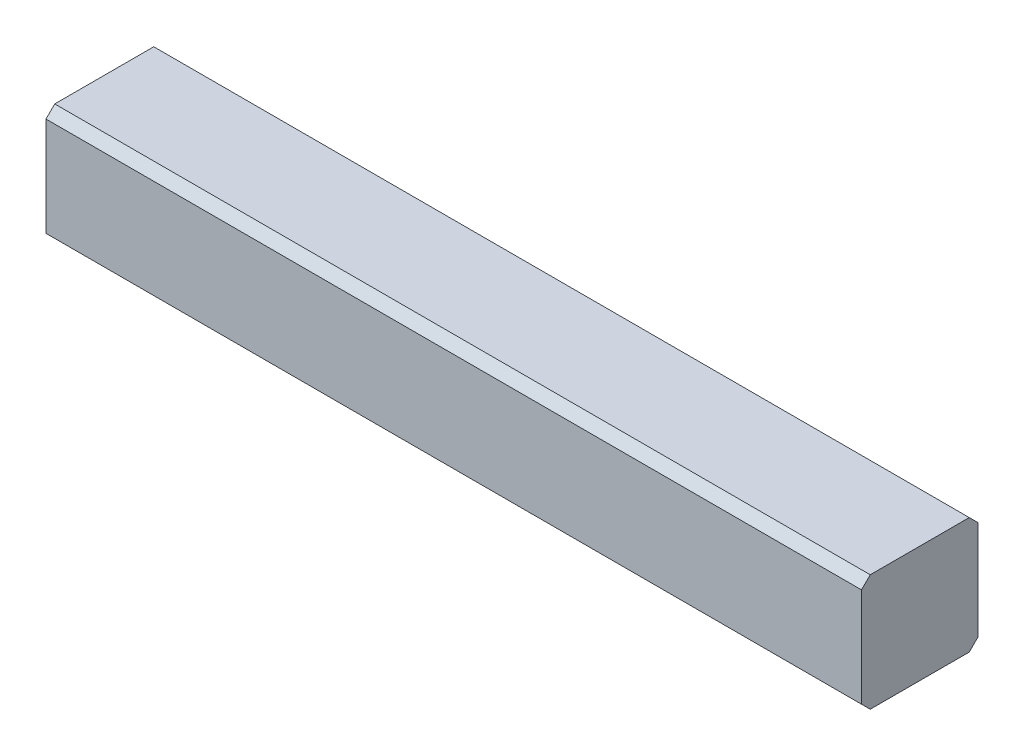
ISO-10303-21;
HEADER;
FILE_DESCRIPTION(('STEP AP214'),'2;1');
FILE_NAME('part.step','',(''),(''),'','','');
FILE_SCHEMA(('AUTOMOTIVE_DESIGN { 1 0 10303 214 1 1 1 1 }'));
ENDSEC;
DATA;
#1=APPLICATION_CONTEXT('core data for automotive mechanical design processes');
#2=APPLICATION_PROTOCOL_DEFINITION('international standard','automotive_design',2000,#1);
#3=PRODUCT_CONTEXT('',#1,'mechanical');
#4=PRODUCT('Part','Part','',(#3));
#5=PRODUCT_RELATED_PRODUCT_CATEGORY('part','',(#4));
#6=PRODUCT_DEFINITION_FORMATION('','',#4);
#7=PRODUCT_DEFINITION_CONTEXT('part definition',#1,'design');
#8=PRODUCT_DEFINITION('design','',#6,#7);
#9=PRODUCT_DEFINITION_SHAPE('','',#8);
#10=(LENGTH_UNIT() NAMED_UNIT(*) SI_UNIT(.MILLI.,.METRE.));
#11=(NAMED_UNIT(*) PLANE_ANGLE_UNIT() SI_UNIT($,.RADIAN.));
#12=(NAMED_UNIT(*) SI_UNIT($,.STERADIAN.) SOLID_ANGLE_UNIT());
#13=UNCERTAINTY_MEASURE_WITH_UNIT(LENGTH_MEASURE(1.E-05),#10,'distance_accuracy_value','');
#14=(GEOMETRIC_REPRESENTATION_CONTEXT(3) GLOBAL_UNCERTAINTY_ASSIGNED_CONTEXT((#13)) GLOBAL_UNIT_ASSIGNED_CONTEXT((#10,
#11,#12)) REPRESENTATION_CONTEXT('',''));
#15=CARTESIAN_POINT('',(0.,0.,0.));
#16=DIRECTION('',(0.,0.,1.));
#17=DIRECTION('',(1.,0.,0.));
#18=AXIS2_PLACEMENT_3D('',#15,#16,#17);
#19=CARTESIAN_POINT('',(14.,0.849999999999962,1.00000000000001));
#20=DIRECTION('',(0.,0.,-1.));
#21=DIRECTION('',(0.,1.,0.));
#22=AXIS2_PLACEMENT_3D('',#19,#20,#21);
#23=PLANE('',#22);
#24=DIRECTION('',(0.,-1.,0.));
#25=VECTOR('',#24,1.);
#26=CARTESIAN_POINT('',(0.,0.849999999999948,0.99999999999998));
#27=LINE('',#26,#25);
#28=CARTESIAN_POINT('',(0.,0.849999999999948,0.99999999999998));
#29=VERTEX_POINT('',#28);
#30=CARTESIAN_POINT('',(0.,-0.850000000000045,0.99999999999998));
#31=VERTEX_POINT('',#30);
#32=EDGE_CURVE('E128',#29,#31,#27,.T.);
#33=ORIENTED_EDGE('',*,*,#32,.T.);
#34=DIRECTION('',(-0.999999999999998,0.,0.));
#35=VECTOR('',#34,1.);
#36=CARTESIAN_POINT('',(14.,-0.850000000000017,0.99999999999998));
#37=LINE('',#36,#35);
#38=CARTESIAN_POINT('',(14.,-0.850000000000017,0.99999999999998));
#39=VERTEX_POINT('',#38);
#40=EDGE_CURVE('E11',#39,#31,#37,.T.);
#41=ORIENTED_EDGE('',*,*,#40,.F.);
#42=DIRECTION('',(0.,-1.,0.));
#43=VECTOR('',#42,1.);
#44=CARTESIAN_POINT('',(14.,0.849999999999962,1.00000000000001));
#45=LINE('',#44,#43);
#46=CARTESIAN_POINT('',(14.,0.849999999999962,1.00000000000001));
#47=VERTEX_POINT('',#46);
#48=EDGE_CURVE('E142',#47,#39,#45,.T.);
#49=ORIENTED_EDGE('',*,*,#48,.F.);
#50=DIRECTION('',(-0.999999999999998,0.,0.));
#51=VECTOR('',#50,1.);
#52=CARTESIAN_POINT('',(14.,0.849999999999962,1.00000000000001));
#53=LINE('',#52,#51);
#54=EDGE_CURVE('E124',#47,#29,#53,.T.);
#55=ORIENTED_EDGE('',*,*,#54,.T.);
#56=EDGE_LOOP('',(#33,#41,#49,#55));
#57=FACE_BOUND('',#56,.T.);
#58=ADVANCED_FACE('F32',(#57),#23,.F.);
#59=CARTESIAN_POINT('',(14.,-0.850000000000017,0.99999999999998));
#60=DIRECTION('',(0.,0.70710678118655,-0.707106781186548));
#61=DIRECTION('',(0.,0.707106781186549,0.707106781186549));
#62=AXIS2_PLACEMENT_3D('',#59,#60,#61);
#63=PLANE('',#62);
#64=DIRECTION('',(0.,-0.707106781186549,-0.707106781186549));
#65=VECTOR('',#64,1.);
#66=CARTESIAN_POINT('',(0.,-0.850000000000045,0.99999999999998));
#67=LINE('',#66,#65);
#68=CARTESIAN_POINT('',(0.,-1.00000000000006,0.849999999999997));
#69=VERTEX_POINT('',#68);
#70=EDGE_CURVE('E131',#31,#69,#67,.T.);
#71=ORIENTED_EDGE('',*,*,#70,.T.);
#72=DIRECTION('',(-0.999999999999998,0.,0.));
#73=VECTOR('',#72,1.);
#74=CARTESIAN_POINT('',(14.,-1.00000000000006,0.849999999999997));
#75=LINE('',#74,#73);
#76=CARTESIAN_POINT('',(14.,-1.00000000000006,0.849999999999997));
#77=VERTEX_POINT('',#76);
#78=EDGE_CURVE('E40',#77,#69,#75,.T.);
#79=ORIENTED_EDGE('',*,*,#78,.F.);
#80=DIRECTION('',(0.,-0.707106781186549,-0.707106781186549));
#81=VECTOR('',#80,1.);
#82=CARTESIAN_POINT('',(14.,-0.850000000000017,0.99999999999998));
#83=LINE('',#82,#81);
#84=EDGE_CURVE('E91',#39,#77,#83,.T.);
#85=ORIENTED_EDGE('',*,*,#84,.F.);
#86=ORIENTED_EDGE('',*,*,#40,.T.);
#87=EDGE_LOOP('',(#71,#79,#85,#86));
#88=FACE_BOUND('',#87,.T.);
#89=ADVANCED_FACE('F177',(#88),#63,.F.);
#90=CARTESIAN_POINT('',(14.,-1.00000000000006,0.849999999999997));
#91=DIRECTION('',(0.,1.,0.));
#92=DIRECTION('',(0.,0.,1.));
#93=AXIS2_PLACEMENT_3D('',#90,#91,#92);
#94=PLANE('',#93);
#95=DIRECTION('',(0.,0.,-1.));
#96=VECTOR('',#95,1.);
#97=CARTESIAN_POINT('',(0.,-1.00000000000006,0.849999999999997));
#98=LINE('',#97,#96);
#99=CARTESIAN_POINT('',(0.,-1.00000000000001,-0.850000000000004));
#100=VERTEX_POINT('',#99);
#101=EDGE_CURVE('E133',#69,#100,#98,.T.);
#102=ORIENTED_EDGE('',*,*,#101,.T.);
#103=DIRECTION('',(-0.999999999999998,0.,0.));
#104=VECTOR('',#103,1.);
#105=CARTESIAN_POINT('',(14.,-1.00000000000001,-0.850000000000004));
#106=LINE('',#105,#104);
#107=CARTESIAN_POINT('',(14.,-1.00000000000001,-0.850000000000004));
#108=VERTEX_POINT('',#107);
#109=EDGE_CURVE('E149',#108,#100,#106,.T.);
#110=ORIENTED_EDGE('',*,*,#109,.F.);
#111=DIRECTION('',(0.,0.,-1.));
#112=VECTOR('',#111,1.);
#113=CARTESIAN_POINT('',(14.,-1.00000000000006,0.849999999999997));
#114=LINE('',#113,#112);
#115=EDGE_CURVE('E157',#77,#108,#114,.T.);
#116=ORIENTED_EDGE('',*,*,#115,.F.);
#117=ORIENTED_EDGE('',*,*,#78,.T.);
#118=EDGE_LOOP('',(#102,#110,#116,#117));
#119=FACE_BOUND('',#118,.T.);
#120=ADVANCED_FACE('F155',(#119),#94,.F.);
#121=CARTESIAN_POINT('',(14.,-1.00000000000001,-0.850000000000004));
#122=DIRECTION('',(0.,0.70710678118655,0.707106781186549));
#123=DIRECTION('',(0.,-0.707106781186549,0.707106781186549));
#124=AXIS2_PLACEMENT_3D('',#121,#122,#123);
#125=PLANE('',#124);
#126=DIRECTION('',(0.,0.707106781186549,-0.70710678118655));
#127=VECTOR('',#126,1.);
#128=CARTESIAN_POINT('',(0.,-1.00000000000001,-0.850000000000004));
#129=LINE('',#128,#127);
#130=CARTESIAN_POINT('',(0.,-0.850000000000059,-1.00000000000001));
#131=VERTEX_POINT('',#130);
#132=EDGE_CURVE('E135',#100,#131,#129,.T.);
#133=ORIENTED_EDGE('',*,*,#132,.T.);
#134=DIRECTION('',(-0.999999999999998,0.,0.));
#135=VECTOR('',#134,1.);
#136=CARTESIAN_POINT('',(14.,-0.850000000000017,-0.999999999999994));
#137=LINE('',#136,#135);
#138=CARTESIAN_POINT('',(14.,-0.850000000000017,-0.999999999999994));
#139=VERTEX_POINT('',#138);
#140=EDGE_CURVE('E146',#139,#131,#137,.T.);
#141=ORIENTED_EDGE('',*,*,#140,.F.);
#142=DIRECTION('',(0.,0.707106781186549,-0.70710678118655));
#143=VECTOR('',#142,1.);
#144=CARTESIAN_POINT('',(14.,-1.00000000000001,-0.850000000000004));
#145=LINE('',#144,#143);
#146=EDGE_CURVE('E169',#108,#139,#145,.T.);
#147=ORIENTED_EDGE('',*,*,#146,.F.);
#148=ORIENTED_EDGE('',*,*,#109,.T.);
#149=EDGE_LOOP('',(#133,#141,#147,#148));
#150=FACE_BOUND('',#149,.T.);
#151=ADVANCED_FACE('F165',(#150),#125,.F.);
#152=CARTESIAN_POINT('',(14.,0.849999999999962,-1.00000000000001));
#153=DIRECTION('',(0.,0.,1.));
#154=DIRECTION('',(0.,-1.,0.));
#155=AXIS2_PLACEMENT_3D('',#152,#153,#154);
#156=PLANE('',#155);
#157=DIRECTION('',(0.,1.,0.));
#158=VECTOR('',#157,1.);
#159=CARTESIAN_POINT('',(0.,0.849999999999962,-1.00000000000001));
#160=LINE('',#159,#158);
#161=CARTESIAN_POINT('',(0.,0.849999999999962,-1.00000000000001));
#162=VERTEX_POINT('',#161);
#163=EDGE_CURVE('E137',#131,#162,#160,.T.);
#164=ORIENTED_EDGE('',*,*,#163,.T.);
#165=DIRECTION('',(-0.999999999999998,0.,0.));
#166=VECTOR('',#165,1.);
#167=CARTESIAN_POINT('',(14.,0.849999999999962,-1.00000000000001));
#168=LINE('',#167,#166);
#169=CARTESIAN_POINT('',(14.,0.849999999999962,-1.00000000000001));
#170=VERTEX_POINT('',#169);
#171=EDGE_CURVE('E119',#170,#162,#168,.T.);
#172=ORIENTED_EDGE('',*,*,#171,.F.);
#173=DIRECTION('',(0.,1.,0.));
#174=VECTOR('',#173,1.);
#175=CARTESIAN_POINT('',(14.,0.849999999999962,-1.00000000000001));
#176=LINE('',#175,#174);
#177=EDGE_CURVE('E110',#139,#170,#176,.T.);
#178=ORIENTED_EDGE('',*,*,#177,.F.);
#179=ORIENTED_EDGE('',*,*,#140,.T.);
#180=EDGE_LOOP('',(#164,#172,#178,#179));
#181=FACE_BOUND('',#180,.T.);
#182=ADVANCED_FACE('F168',(#181),#156,.F.);
#183=CARTESIAN_POINT('',(14.,0.999999999999945,-0.850000000000011));
#184=DIRECTION('',(0.,-0.707106781186549,0.707106781186549));
#185=DIRECTION('',(0.,-0.70710678118655,-0.707106781186549));
#186=AXIS2_PLACEMENT_3D('',#183,#184,#185);
#187=PLANE('',#186);
#188=DIRECTION('',(0.,0.70710678118655,0.707106781186549));
#189=VECTOR('',#188,1.);
#190=CARTESIAN_POINT('',(0.,0.999999999999931,-0.850000000000024));
#191=LINE('',#190,#189);
#192=CARTESIAN_POINT('',(0.,0.999999999999931,-0.850000000000024));
#193=VERTEX_POINT('',#192);
#194=EDGE_CURVE('E118',#162,#193,#191,.T.);
#195=ORIENTED_EDGE('',*,*,#194,.T.);
#196=DIRECTION('',(-0.999999999999998,0.,0.));
#197=VECTOR('',#196,1.);
#198=CARTESIAN_POINT('',(14.,0.999999999999945,-0.850000000000011));
#199=LINE('',#198,#197);
#200=CARTESIAN_POINT('',(14.,0.999999999999945,-0.850000000000011));
#201=VERTEX_POINT('',#200);
#202=EDGE_CURVE('E115',#201,#193,#199,.T.);
#203=ORIENTED_EDGE('',*,*,#202,.F.);
#204=DIRECTION('',(0.,0.70710678118655,0.707106781186549));
#205=VECTOR('',#204,1.);
#206=CARTESIAN_POINT('',(14.,0.999999999999945,-0.850000000000011));
#207=LINE('',#206,#205);
#208=EDGE_CURVE('E104',#170,#201,#207,.T.);
#209=ORIENTED_EDGE('',*,*,#208,.F.);
#210=ORIENTED_EDGE('',*,*,#171,.T.);
#211=EDGE_LOOP('',(#195,#203,#209,#210));
#212=FACE_BOUND('',#211,.T.);
#213=ADVANCED_FACE('F116',(#212),#187,.F.);
#214=CARTESIAN_POINT('',(14.,1.,0.849999999999955));
#215=DIRECTION('',(0.,-1.,0.));
#216=DIRECTION('',(0.,0.,-1.));
#217=AXIS2_PLACEMENT_3D('',#214,#215,#216);
#218=PLANE('',#217);
#219=DIRECTION('',(0.,0.,1.));
#220=VECTOR('',#219,1.);
#221=CARTESIAN_POINT('',(0.,1.,0.849999999999955));
#222=LINE('',#221,#220);
#223=CARTESIAN_POINT('',(0.,1.,0.849999999999955));
#224=VERTEX_POINT('',#223);
#225=EDGE_CURVE('E77',#193,#224,#222,.T.);
#226=ORIENTED_EDGE('',*,*,#225,.T.);
#227=DIRECTION('',(-0.999999999999998,0.,0.));
#228=VECTOR('',#227,1.);
#229=CARTESIAN_POINT('',(14.,1.,0.849999999999955));
#230=LINE('',#229,#228);
#231=CARTESIAN_POINT('',(14.,1.,0.849999999999955));
#232=VERTEX_POINT('',#231);
#233=EDGE_CURVE('E120',#232,#224,#230,.T.);
#234=ORIENTED_EDGE('',*,*,#233,.F.);
#235=DIRECTION('',(0.,0.,1.));
#236=VECTOR('',#235,1.);
#237=CARTESIAN_POINT('',(14.,1.,0.849999999999955));
#238=LINE('',#237,#236);
#239=EDGE_CURVE('E108',#201,#232,#238,.T.);
#240=ORIENTED_EDGE('',*,*,#239,.F.);
#241=ORIENTED_EDGE('',*,*,#202,.T.);
#242=EDGE_LOOP('',(#226,#234,#240,#241));
#243=FACE_BOUND('',#242,.T.);
#244=ADVANCED_FACE('F122',(#243),#218,.F.);
#245=CARTESIAN_POINT('',(14.,1.,0.849999999999955));
#246=DIRECTION('',(0.,-0.707106781186549,-0.707106781186549));
#247=DIRECTION('',(0.,0.70710678118655,-0.707106781186548));
#248=AXIS2_PLACEMENT_3D('',#245,#246,#247);
#249=PLANE('',#248);
#250=DIRECTION('',(0.,-0.70710678118655,0.707106781186548));
#251=VECTOR('',#250,1.);
#252=CARTESIAN_POINT('',(0.,1.,0.849999999999955));
#253=LINE('',#252,#251);
#254=EDGE_CURVE('E83',#224,#29,#253,.T.);
#255=ORIENTED_EDGE('',*,*,#254,.T.);
#256=ORIENTED_EDGE('',*,*,#54,.F.);
#257=DIRECTION('',(0.,-0.70710678118655,0.707106781186548));
#258=VECTOR('',#257,1.);
#259=CARTESIAN_POINT('',(14.,1.,0.849999999999955));
#260=LINE('',#259,#258);
#261=EDGE_CURVE('E48',#232,#47,#260,.T.);
#262=ORIENTED_EDGE('',*,*,#261,.F.);
#263=ORIENTED_EDGE('',*,*,#233,.T.);
#264=EDGE_LOOP('',(#255,#256,#262,#263));
#265=FACE_BOUND('',#264,.T.);
#266=ADVANCED_FACE('F193',(#265),#249,.F.);
#267=CARTESIAN_POINT('',(14.,-1.00000000000006,1.00000000000001));
#268=DIRECTION('',(0.999999999999998,0.,0.));
#269=DIRECTION('',(0.,0.,-1.));
#270=AXIS2_PLACEMENT_3D('',#267,#268,#269);
#271=PLANE('',#270);
#272=ORIENTED_EDGE('',*,*,#48,.T.);
#273=ORIENTED_EDGE('',*,*,#84,.T.);
#274=ORIENTED_EDGE('',*,*,#115,.T.);
#275=ORIENTED_EDGE('',*,*,#146,.T.);
#276=ORIENTED_EDGE('',*,*,#177,.T.);
#277=ORIENTED_EDGE('',*,*,#208,.T.);
#278=ORIENTED_EDGE('',*,*,#239,.T.);
#279=ORIENTED_EDGE('',*,*,#261,.T.);
#280=EDGE_LOOP('',(#272,#273,#274,#275,#276,#277,#278,#279));
#281=FACE_BOUND('',#280,.T.);
#282=ADVANCED_FACE('F106',(#281),#271,.T.);
#283=CARTESIAN_POINT('',(0.,-1.00000000000006,0.99999999999998));
#284=DIRECTION('',(0.999999999999998,0.,0.));
#285=DIRECTION('',(0.,0.,-1.));
#286=AXIS2_PLACEMENT_3D('',#283,#284,#285);
#287=PLANE('',#286);
#288=ORIENTED_EDGE('',*,*,#32,.F.);
#289=ORIENTED_EDGE('',*,*,#254,.F.);
#290=ORIENTED_EDGE('',*,*,#225,.F.);
#291=ORIENTED_EDGE('',*,*,#194,.F.);
#292=ORIENTED_EDGE('',*,*,#163,.F.);
#293=ORIENTED_EDGE('',*,*,#132,.F.);
#294=ORIENTED_EDGE('',*,*,#101,.F.);
#295=ORIENTED_EDGE('',*,*,#70,.F.);
#296=EDGE_LOOP('',(#288,#289,#290,#291,#292,#293,#294,#295));
#297=FACE_BOUND('',#296,.T.);
#298=ADVANCED_FACE('F161',(#297),#287,.F.);
#299=CLOSED_SHELL('',(#58,#89,#120,#151,#182,#213,#244,#266,#282,#298));
#300=MANIFOLD_SOLID_BREP('B2',#299);
#301=ADVANCED_BREP_SHAPE_REPRESENTATION('',(#18,#300),#14);
#302=SHAPE_DEFINITION_REPRESENTATION(#9,#301);
ENDSEC;
END-ISO-10303-21;
